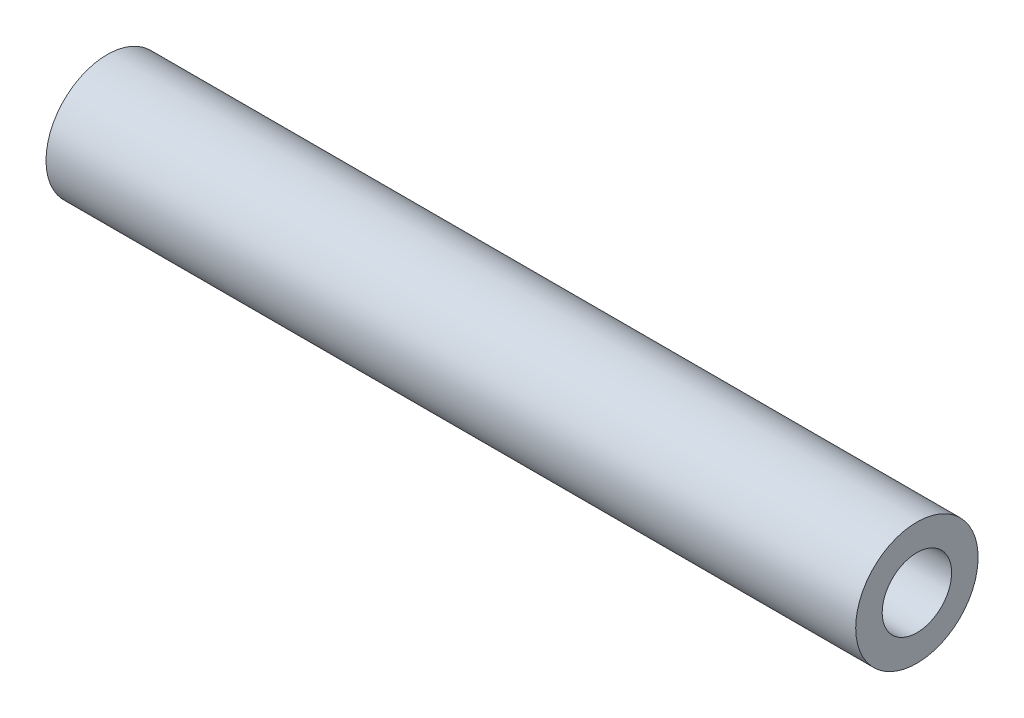
ISO-10303-21;
HEADER;
FILE_DESCRIPTION(('STEP AP214'),'2;1');
FILE_NAME('part.step','',(''),(''),'','','');
FILE_SCHEMA(('AUTOMOTIVE_DESIGN { 1 0 10303 214 1 1 1 1 }'));
ENDSEC;
DATA;
#1=APPLICATION_CONTEXT('core data for automotive mechanical design processes');
#2=APPLICATION_PROTOCOL_DEFINITION('international standard','automotive_design',2000,#1);
#3=PRODUCT_CONTEXT('',#1,'mechanical');
#4=PRODUCT('Part','Part','',(#3));
#5=PRODUCT_RELATED_PRODUCT_CATEGORY('part','',(#4));
#6=PRODUCT_DEFINITION_FORMATION('','',#4);
#7=PRODUCT_DEFINITION_CONTEXT('part definition',#1,'design');
#8=PRODUCT_DEFINITION('design','',#6,#7);
#9=PRODUCT_DEFINITION_SHAPE('','',#8);
#10=(LENGTH_UNIT() NAMED_UNIT(*) SI_UNIT(.MILLI.,.METRE.));
#11=(NAMED_UNIT(*) PLANE_ANGLE_UNIT() SI_UNIT($,.RADIAN.));
#12=(NAMED_UNIT(*) SI_UNIT($,.STERADIAN.) SOLID_ANGLE_UNIT());
#13=UNCERTAINTY_MEASURE_WITH_UNIT(LENGTH_MEASURE(1.E-05),#10,'distance_accuracy_value','');
#14=(GEOMETRIC_REPRESENTATION_CONTEXT(3) GLOBAL_UNCERTAINTY_ASSIGNED_CONTEXT((#13)) GLOBAL_UNIT_ASSIGNED_CONTEXT((#10,
#11,#12)) REPRESENTATION_CONTEXT('',''));
#15=CARTESIAN_POINT('',(0.,0.,0.));
#16=DIRECTION('',(0.,0.,1.));
#17=DIRECTION('',(1.,0.,0.));
#18=AXIS2_PLACEMENT_3D('',#15,#16,#17);
#19=CARTESIAN_POINT('',(29.765625,0.,0.));
#20=DIRECTION('',(-1.,0.,0.));
#21=DIRECTION('',(0.,0.,1.));
#22=AXIS2_PLACEMENT_3D('',#19,#20,#21);
#23=CYLINDRICAL_SURFACE('',#22,2.5527);
#24=CARTESIAN_POINT('',(-29.765625,0.,0.));
#25=DIRECTION('',(-1.,0.,0.));
#26=DIRECTION('',(0.,0.,1.));
#27=AXIS2_PLACEMENT_3D('',#24,#25,#26);
#28=CIRCLE('',#27,2.5527);
#29=CARTESIAN_POINT('',(-29.765625,0.,2.5527));
#30=VERTEX_POINT('',#29);
#31=EDGE_CURVE('E27',#30,#30,#28,.T.);
#32=ORIENTED_EDGE('',*,*,#31,.T.);
#33=EDGE_LOOP('',(#32));
#34=FACE_BOUND('',#33,.T.);
#35=CARTESIAN_POINT('',(29.765625,0.,0.));
#36=DIRECTION('',(-1.,0.,0.));
#37=DIRECTION('',(0.,0.,1.));
#38=AXIS2_PLACEMENT_3D('',#35,#36,#37);
#39=CIRCLE('',#38,2.5527);
#40=CARTESIAN_POINT('',(29.765625,0.,2.5527));
#41=VERTEX_POINT('',#40);
#42=EDGE_CURVE('E18',#41,#41,#39,.T.);
#43=ORIENTED_EDGE('',*,*,#42,.F.);
#44=EDGE_LOOP('',(#43));
#45=FACE_BOUND('',#44,.T.);
#46=ADVANCED_FACE('F15',(#34,#45),#23,.F.);
#47=CARTESIAN_POINT('',(29.765625,0.,0.));
#48=DIRECTION('',(1.,0.,0.));
#49=DIRECTION('',(0.,0.,-1.));
#50=AXIS2_PLACEMENT_3D('',#47,#48,#49);
#51=PLANE('',#50);
#52=ORIENTED_EDGE('',*,*,#42,.T.);
#53=EDGE_LOOP('',(#52));
#54=FACE_BOUND('',#53,.T.);
#55=CARTESIAN_POINT('',(29.765625,0.,0.));
#56=DIRECTION('',(-1.,0.,0.));
#57=DIRECTION('',(0.,0.,1.));
#58=AXIS2_PLACEMENT_3D('',#55,#56,#57);
#59=CIRCLE('',#58,4.5);
#60=CARTESIAN_POINT('',(29.765625,0.,4.5));
#61=VERTEX_POINT('',#60);
#62=EDGE_CURVE('E22',#61,#61,#59,.T.);
#63=ORIENTED_EDGE('',*,*,#62,.F.);
#64=EDGE_LOOP('',(#63));
#65=FACE_BOUND('',#64,.T.);
#66=ADVANCED_FACE('F35',(#54,#65),#51,.T.);
#67=CARTESIAN_POINT('',(-29.765625,0.,0.));
#68=DIRECTION('',(1.,0.,0.));
#69=DIRECTION('',(0.,0.,-1.));
#70=AXIS2_PLACEMENT_3D('',#67,#68,#69);
#71=PLANE('',#70);
#72=ORIENTED_EDGE('',*,*,#31,.F.);
#73=EDGE_LOOP('',(#72));
#74=FACE_BOUND('',#73,.T.);
#75=CARTESIAN_POINT('',(-29.765625,0.,0.));
#76=DIRECTION('',(-1.,0.,0.));
#77=DIRECTION('',(0.,0.,1.));
#78=AXIS2_PLACEMENT_3D('',#75,#76,#77);
#79=CIRCLE('',#78,4.5);
#80=CARTESIAN_POINT('',(-29.765625,0.,4.5));
#81=VERTEX_POINT('',#80);
#82=EDGE_CURVE('E10',#81,#81,#79,.F.);
#83=ORIENTED_EDGE('',*,*,#82,.F.);
#84=EDGE_LOOP('',(#83));
#85=FACE_BOUND('',#84,.T.);
#86=ADVANCED_FACE('F43',(#74,#85),#71,.F.);
#87=CARTESIAN_POINT('',(29.765625,0.,0.));
#88=DIRECTION('',(-1.,0.,0.));
#89=DIRECTION('',(0.,0.,1.));
#90=AXIS2_PLACEMENT_3D('',#87,#88,#89);
#91=CYLINDRICAL_SURFACE('',#90,4.5);
#92=ORIENTED_EDGE('',*,*,#82,.T.);
#93=EDGE_LOOP('',(#92));
#94=FACE_BOUND('',#93,.T.);
#95=ORIENTED_EDGE('',*,*,#62,.T.);
#96=EDGE_LOOP('',(#95));
#97=FACE_BOUND('',#96,.T.);
#98=ADVANCED_FACE('F44',(#94,#97),#91,.T.);
#99=CLOSED_SHELL('',(#46,#66,#86,#98));
#100=MANIFOLD_SOLID_BREP('B1',#99);
#101=ADVANCED_BREP_SHAPE_REPRESENTATION('',(#18,#100),#14);
#102=SHAPE_DEFINITION_REPRESENTATION(#9,#101);
ENDSEC;
END-ISO-10303-21;
